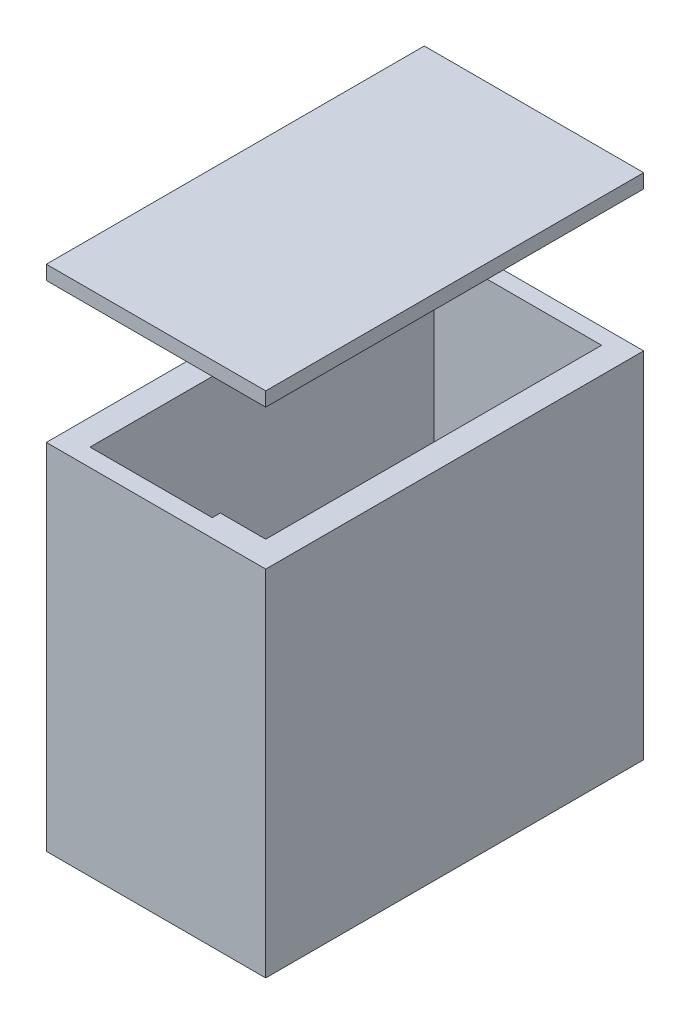
ISO-10303-21;
HEADER;
FILE_DESCRIPTION(('STEP AP214'),'2;1');
FILE_NAME('part.step','',(''),(''),'','','');
FILE_SCHEMA(('AUTOMOTIVE_DESIGN { 1 0 10303 214 1 1 1 1 }'));
ENDSEC;
DATA;
#1=APPLICATION_CONTEXT('core data for automotive mechanical design processes');
#2=APPLICATION_PROTOCOL_DEFINITION('international standard','automotive_design',2000,#1);
#3=PRODUCT_CONTEXT('',#1,'mechanical');
#4=PRODUCT('Part','Part','',(#3));
#5=PRODUCT_RELATED_PRODUCT_CATEGORY('part','',(#4));
#6=PRODUCT_DEFINITION_FORMATION('','',#4);
#7=PRODUCT_DEFINITION_CONTEXT('part definition',#1,'design');
#8=PRODUCT_DEFINITION('design','',#6,#7);
#9=PRODUCT_DEFINITION_SHAPE('','',#8);
#10=(LENGTH_UNIT() NAMED_UNIT(*) SI_UNIT(.MILLI.,.METRE.));
#11=(NAMED_UNIT(*) PLANE_ANGLE_UNIT() SI_UNIT($,.RADIAN.));
#12=(NAMED_UNIT(*) SI_UNIT($,.STERADIAN.) SOLID_ANGLE_UNIT());
#13=UNCERTAINTY_MEASURE_WITH_UNIT(LENGTH_MEASURE(1.E-05),#10,'distance_accuracy_value','');
#14=(GEOMETRIC_REPRESENTATION_CONTEXT(3) GLOBAL_UNCERTAINTY_ASSIGNED_CONTEXT((#13)) GLOBAL_UNIT_ASSIGNED_CONTEXT((#10,
#11,#12)) REPRESENTATION_CONTEXT('',''));
#15=CARTESIAN_POINT('',(0.,0.,0.));
#16=DIRECTION('',(0.,0.,1.));
#17=DIRECTION('',(1.,0.,0.));
#18=AXIS2_PLACEMENT_3D('',#15,#16,#17);
#19=CARTESIAN_POINT('',(0.,2090.,0.));
#20=DIRECTION('',(1.,0.,0.));
#21=DIRECTION('',(0.,0.,-1.));
#22=AXIS2_PLACEMENT_3D('',#19,#20,#21);
#23=PLANE('',#22);
#24=DIRECTION('',(0.,0.,1.));
#25=VECTOR('',#24,1.);
#26=CARTESIAN_POINT('',(0.,2090.,0.));
#27=LINE('',#26,#25);
#28=CARTESIAN_POINT('',(0.,2090.,-2337.20858757062));
#29=VERTEX_POINT('',#28);
#30=CARTESIAN_POINT('',(0.,2090.,0.));
#31=VERTEX_POINT('',#30);
#32=EDGE_CURVE('E217',#29,#31,#27,.T.);
#33=ORIENTED_EDGE('',*,*,#32,.F.);
#34=DIRECTION('',(0.,1.,0.));
#35=VECTOR('',#34,1.);
#36=CARTESIAN_POINT('',(0.,-100.,-2337.20858757062));
#37=LINE('',#36,#35);
#38=CARTESIAN_POINT('',(0.,-100.,-2337.20858757062));
#39=VERTEX_POINT('',#38);
#40=EDGE_CURVE('E232',#39,#29,#37,.T.);
#41=ORIENTED_EDGE('',*,*,#40,.F.);
#42=DIRECTION('',(0.,0.,-1.));
#43=VECTOR('',#42,1.);
#44=CARTESIAN_POINT('',(0.,-100.,0.));
#45=LINE('',#44,#43);
#46=CARTESIAN_POINT('',(0.,-100.,0.));
#47=VERTEX_POINT('',#46);
#48=EDGE_CURVE('E222',#47,#39,#45,.T.);
#49=ORIENTED_EDGE('',*,*,#48,.F.);
#50=DIRECTION('',(0.,-1.,0.));
#51=VECTOR('',#50,1.);
#52=CARTESIAN_POINT('',(0.,2090.,0.));
#53=LINE('',#52,#51);
#54=EDGE_CURVE('E253',#31,#47,#53,.T.);
#55=ORIENTED_EDGE('',*,*,#54,.F.);
#56=EDGE_LOOP('',(#33,#41,#49,#55));
#57=FACE_BOUND('',#56,.T.);
#58=ADVANCED_FACE('F99',(#57),#23,.F.);
#59=CARTESIAN_POINT('',(0.,2090.,0.));
#60=DIRECTION('',(0.,0.,-1.));
#61=DIRECTION('',(-1.,0.,0.));
#62=AXIS2_PLACEMENT_3D('',#59,#60,#61);
#63=PLANE('',#62);
#64=ORIENTED_EDGE('',*,*,#54,.T.);
#65=DIRECTION('',(-1.,0.,0.));
#66=VECTOR('',#65,1.);
#67=CARTESIAN_POINT('',(1356.72768361582,-100.,0.));
#68=LINE('',#67,#66);
#69=CARTESIAN_POINT('',(1356.72768361582,-100.,0.));
#70=VERTEX_POINT('',#69);
#71=EDGE_CURVE('E224',#70,#47,#68,.T.);
#72=ORIENTED_EDGE('',*,*,#71,.F.);
#73=DIRECTION('',(0.,-1.,0.));
#74=VECTOR('',#73,1.);
#75=CARTESIAN_POINT('',(1356.72768361582,2090.,0.));
#76=LINE('',#75,#74);
#77=CARTESIAN_POINT('',(1356.72768361582,2090.,0.));
#78=VERTEX_POINT('',#77);
#79=EDGE_CURVE('E220',#78,#70,#76,.T.);
#80=ORIENTED_EDGE('',*,*,#79,.F.);
#81=DIRECTION('',(1.,0.,0.));
#82=VECTOR('',#81,1.);
#83=CARTESIAN_POINT('',(0.,2090.,0.));
#84=LINE('',#83,#82);
#85=EDGE_CURVE('E214',#31,#78,#84,.T.);
#86=ORIENTED_EDGE('',*,*,#85,.F.);
#87=EDGE_LOOP('',(#64,#72,#80,#86));
#88=FACE_BOUND('',#87,.T.);
#89=ADVANCED_FACE('F258',(#88),#63,.F.);
#90=CARTESIAN_POINT('',(1356.72768361582,2090.,0.));
#91=DIRECTION('',(-1.,0.,0.));
#92=DIRECTION('',(0.,0.,1.));
#93=AXIS2_PLACEMENT_3D('',#90,#91,#92);
#94=PLANE('',#93);
#95=ORIENTED_EDGE('',*,*,#79,.T.);
#96=DIRECTION('',(0.,0.,1.));
#97=VECTOR('',#96,1.);
#98=CARTESIAN_POINT('',(1356.72768361582,-100.,0.));
#99=LINE('',#98,#97);
#100=CARTESIAN_POINT('',(1356.72768361582,-100.,-2337.20858757062));
#101=VERTEX_POINT('',#100);
#102=EDGE_CURVE('E213',#101,#70,#99,.T.);
#103=ORIENTED_EDGE('',*,*,#102,.F.);
#104=DIRECTION('',(0.,-1.,0.));
#105=VECTOR('',#104,1.);
#106=CARTESIAN_POINT('',(1356.72768361582,-100.,-2337.20858757062));
#107=LINE('',#106,#105);
#108=CARTESIAN_POINT('',(1356.72768361582,2090.,-2337.20858757062));
#109=VERTEX_POINT('',#108);
#110=EDGE_CURVE('E103',#109,#101,#107,.T.);
#111=ORIENTED_EDGE('',*,*,#110,.F.);
#112=DIRECTION('',(0.,0.,-1.));
#113=VECTOR('',#112,1.);
#114=CARTESIAN_POINT('',(1356.72768361582,2090.,0.));
#115=LINE('',#114,#113);
#116=EDGE_CURVE('E211',#78,#109,#115,.T.);
#117=ORIENTED_EDGE('',*,*,#116,.F.);
#118=EDGE_LOOP('',(#95,#103,#111,#117));
#119=FACE_BOUND('',#118,.T.);
#120=ADVANCED_FACE('F245',(#119),#94,.F.);
#121=CARTESIAN_POINT('',(0.,2090.,0.));
#122=DIRECTION('',(0.,-1.,0.));
#123=DIRECTION('',(0.,0.,-1.));
#124=AXIS2_PLACEMENT_3D('',#121,#122,#123);
#125=PLANE('',#124);
#126=ORIENTED_EDGE('',*,*,#32,.T.);
#127=ORIENTED_EDGE('',*,*,#85,.T.);
#128=ORIENTED_EDGE('',*,*,#116,.T.);
#129=DIRECTION('',(1.,0.,0.));
#130=VECTOR('',#129,1.);
#131=CARTESIAN_POINT('',(1356.72768361582,2090.,-2337.20858757062));
#132=LINE('',#131,#130);
#133=EDGE_CURVE('E171',#29,#109,#132,.T.);
#134=ORIENTED_EDGE('',*,*,#133,.F.);
#135=EDGE_LOOP('',(#126,#127,#128,#134));
#136=FACE_BOUND('',#135,.T.);
#137=DIRECTION('',(0.,0.,1.));
#138=VECTOR('',#137,1.);
#139=CARTESIAN_POINT('',(1196.72768361582,2090.,-160.));
#140=LINE('',#139,#138);
#141=CARTESIAN_POINT('',(1196.72768361582,2090.,-2237.20858757062));
#142=VERTEX_POINT('',#141);
#143=CARTESIAN_POINT('',(1196.72768361582,2090.,-160.));
#144=VERTEX_POINT('',#143);
#145=EDGE_CURVE('E204',#142,#144,#140,.T.);
#146=ORIENTED_EDGE('',*,*,#145,.T.);
#147=DIRECTION('',(-1.,0.,0.));
#148=VECTOR('',#147,1.);
#149=CARTESIAN_POINT('',(915.947269303202,2090.,-160.));
#150=LINE('',#149,#148);
#151=CARTESIAN_POINT('',(915.947269303202,2090.,-160.));
#152=VERTEX_POINT('',#151);
#153=EDGE_CURVE('E208',#144,#152,#150,.T.);
#154=ORIENTED_EDGE('',*,*,#153,.T.);
#155=DIRECTION('',(0.,0.,1.));
#156=VECTOR('',#155,1.);
#157=CARTESIAN_POINT('',(915.947269303202,2090.,-110.));
#158=LINE('',#157,#156);
#159=CARTESIAN_POINT('',(915.947269303202,2090.,-110.));
#160=VERTEX_POINT('',#159);
#161=EDGE_CURVE('E166',#152,#160,#158,.T.);
#162=ORIENTED_EDGE('',*,*,#161,.T.);
#163=DIRECTION('',(-1.,0.,0.));
#164=VECTOR('',#163,1.);
#165=CARTESIAN_POINT('',(160.,2090.,-110.));
#166=LINE('',#165,#164);
#167=CARTESIAN_POINT('',(160.,2090.,-110.));
#168=VERTEX_POINT('',#167);
#169=EDGE_CURVE('E159',#160,#168,#166,.T.);
#170=ORIENTED_EDGE('',*,*,#169,.T.);
#171=DIRECTION('',(0.,0.,-1.));
#172=VECTOR('',#171,1.);
#173=CARTESIAN_POINT('',(160.,2090.,-2237.20858757062));
#174=LINE('',#173,#172);
#175=CARTESIAN_POINT('',(160.000000000001,2090.,-2237.20858757062));
#176=VERTEX_POINT('',#175);
#177=EDGE_CURVE('E162',#168,#176,#174,.T.);
#178=ORIENTED_EDGE('',*,*,#177,.T.);
#179=DIRECTION('',(1.,0.,0.));
#180=VECTOR('',#179,1.);
#181=CARTESIAN_POINT('',(1356.72768361582,2090.,-2237.20858757062));
#182=LINE('',#181,#180);
#183=EDGE_CURVE('E181',#176,#142,#182,.T.);
#184=ORIENTED_EDGE('',*,*,#183,.T.);
#185=EDGE_LOOP('',(#146,#154,#162,#170,#178,#184));
#186=FACE_BOUND('',#185,.T.);
#187=ADVANCED_FACE('F101',(#136,#186),#125,.F.);
#188=CARTESIAN_POINT('',(0.,-100.,0.));
#189=DIRECTION('',(0.,1.,0.));
#190=DIRECTION('',(0.,0.,1.));
#191=AXIS2_PLACEMENT_3D('',#188,#189,#190);
#192=PLANE('',#191);
#193=ORIENTED_EDGE('',*,*,#102,.T.);
#194=ORIENTED_EDGE('',*,*,#71,.T.);
#195=ORIENTED_EDGE('',*,*,#48,.T.);
#196=DIRECTION('',(-1.,0.,0.));
#197=VECTOR('',#196,1.);
#198=CARTESIAN_POINT('',(1356.72768361582,-100.,-2337.20858757062));
#199=LINE('',#198,#197);
#200=EDGE_CURVE('E234',#101,#39,#199,.T.);
#201=ORIENTED_EDGE('',*,*,#200,.F.);
#202=EDGE_LOOP('',(#193,#194,#195,#201));
#203=FACE_BOUND('',#202,.T.);
#204=ADVANCED_FACE('F249',(#203),#192,.F.);
#205=CARTESIAN_POINT('',(0.,0.,-2337.20858757062));
#206=DIRECTION('',(0.,0.,1.));
#207=DIRECTION('',(1.,0.,0.));
#208=AXIS2_PLACEMENT_3D('',#205,#206,#207);
#209=PLANE('',#208);
#210=ORIENTED_EDGE('',*,*,#110,.T.);
#211=ORIENTED_EDGE('',*,*,#200,.T.);
#212=ORIENTED_EDGE('',*,*,#40,.T.);
#213=ORIENTED_EDGE('',*,*,#133,.T.);
#214=EDGE_LOOP('',(#210,#211,#212,#213));
#215=FACE_BOUND('',#214,.T.);
#216=ADVANCED_FACE('F241',(#215),#209,.F.);
#217=CARTESIAN_POINT('',(915.947269303202,2090.,-160.));
#218=DIRECTION('',(0.,0.,1.));
#219=DIRECTION('',(1.,0.,0.));
#220=AXIS2_PLACEMENT_3D('',#217,#218,#219);
#221=PLANE('',#220);
#222=DIRECTION('',(-1.,0.,0.));
#223=VECTOR('',#222,1.);
#224=CARTESIAN_POINT('',(915.947269303202,0.,-160.));
#225=LINE('',#224,#223);
#226=CARTESIAN_POINT('',(1196.72768361582,0.,-160.));
#227=VERTEX_POINT('',#226);
#228=CARTESIAN_POINT('',(915.947269303202,0.,-160.));
#229=VERTEX_POINT('',#228);
#230=EDGE_CURVE('E200',#227,#229,#225,.T.);
#231=ORIENTED_EDGE('',*,*,#230,.T.);
#232=DIRECTION('',(0.,-1.,0.));
#233=VECTOR('',#232,1.);
#234=CARTESIAN_POINT('',(915.947269303202,2090.,-160.));
#235=LINE('',#234,#233);
#236=EDGE_CURVE('E195',#152,#229,#235,.T.);
#237=ORIENTED_EDGE('',*,*,#236,.F.);
#238=ORIENTED_EDGE('',*,*,#153,.F.);
#239=DIRECTION('',(0.,-1.,0.));
#240=VECTOR('',#239,1.);
#241=CARTESIAN_POINT('',(1196.72768361582,2090.,-160.));
#242=LINE('',#241,#240);
#243=EDGE_CURVE('E203',#144,#227,#242,.T.);
#244=ORIENTED_EDGE('',*,*,#243,.T.);
#245=EDGE_LOOP('',(#231,#237,#238,#244));
#246=FACE_BOUND('',#245,.T.);
#247=ADVANCED_FACE('F271',(#246),#221,.F.);
#248=CARTESIAN_POINT('',(915.947269303202,2090.,-110.));
#249=DIRECTION('',(1.,0.,0.));
#250=DIRECTION('',(0.,0.,-1.));
#251=AXIS2_PLACEMENT_3D('',#248,#249,#250);
#252=PLANE('',#251);
#253=DIRECTION('',(0.,0.,1.));
#254=VECTOR('',#253,1.);
#255=CARTESIAN_POINT('',(915.947269303202,0.,-110.));
#256=LINE('',#255,#254);
#257=CARTESIAN_POINT('',(915.947269303202,0.,-110.));
#258=VERTEX_POINT('',#257);
#259=EDGE_CURVE('E197',#229,#258,#256,.T.);
#260=ORIENTED_EDGE('',*,*,#259,.T.);
#261=DIRECTION('',(0.,-1.,0.));
#262=VECTOR('',#261,1.);
#263=CARTESIAN_POINT('',(915.947269303202,2090.,-110.));
#264=LINE('',#263,#262);
#265=EDGE_CURVE('E189',#160,#258,#264,.T.);
#266=ORIENTED_EDGE('',*,*,#265,.F.);
#267=ORIENTED_EDGE('',*,*,#161,.F.);
#268=ORIENTED_EDGE('',*,*,#236,.T.);
#269=EDGE_LOOP('',(#260,#266,#267,#268));
#270=FACE_BOUND('',#269,.T.);
#271=ADVANCED_FACE('F266',(#270),#252,.F.);
#272=CARTESIAN_POINT('',(0.,0.,0.));
#273=DIRECTION('',(0.,1.,0.));
#274=DIRECTION('',(0.,0.,1.));
#275=AXIS2_PLACEMENT_3D('',#272,#273,#274);
#276=PLANE('',#275);
#277=DIRECTION('',(0.,0.,-1.));
#278=VECTOR('',#277,1.);
#279=CARTESIAN_POINT('',(160.,0.,-2237.20858757062));
#280=LINE('',#279,#278);
#281=CARTESIAN_POINT('',(160.,0.,-110.));
#282=VERTEX_POINT('',#281);
#283=CARTESIAN_POINT('',(160.000000000001,0.,-2237.20858757062));
#284=VERTEX_POINT('',#283);
#285=EDGE_CURVE('E187',#282,#284,#280,.T.);
#286=ORIENTED_EDGE('',*,*,#285,.F.);
#287=DIRECTION('',(-1.,0.,0.));
#288=VECTOR('',#287,1.);
#289=CARTESIAN_POINT('',(160.,0.,-110.));
#290=LINE('',#289,#288);
#291=EDGE_CURVE('E186',#258,#282,#290,.T.);
#292=ORIENTED_EDGE('',*,*,#291,.F.);
#293=ORIENTED_EDGE('',*,*,#259,.F.);
#294=ORIENTED_EDGE('',*,*,#230,.F.);
#295=DIRECTION('',(0.,0.,1.));
#296=VECTOR('',#295,1.);
#297=CARTESIAN_POINT('',(1196.72768361582,0.,-160.));
#298=LINE('',#297,#296);
#299=CARTESIAN_POINT('',(1196.72768361582,0.,-2237.20858757062));
#300=VERTEX_POINT('',#299);
#301=EDGE_CURVE('E109',#300,#227,#298,.T.);
#302=ORIENTED_EDGE('',*,*,#301,.F.);
#303=DIRECTION('',(1.,0.,0.));
#304=VECTOR('',#303,1.);
#305=CARTESIAN_POINT('',(1356.72768361582,0.,-2237.20858757062));
#306=LINE('',#305,#304);
#307=EDGE_CURVE('E118',#284,#300,#306,.T.);
#308=ORIENTED_EDGE('',*,*,#307,.F.);
#309=EDGE_LOOP('',(#286,#292,#293,#294,#302,#308));
#310=FACE_BOUND('',#309,.T.);
#311=ADVANCED_FACE('F279',(#310),#276,.T.);
#312=CARTESIAN_POINT('',(0.,0.,-2237.20858757062));
#313=DIRECTION('',(0.,0.,1.));
#314=DIRECTION('',(1.,0.,0.));
#315=AXIS2_PLACEMENT_3D('',#312,#313,#314);
#316=PLANE('',#315);
#317=ORIENTED_EDGE('',*,*,#183,.F.);
#318=DIRECTION('',(0.,-1.,0.));
#319=VECTOR('',#318,1.);
#320=CARTESIAN_POINT('',(160.,2090.,-2237.20858757062));
#321=LINE('',#320,#319);
#322=EDGE_CURVE('E180',#176,#284,#321,.T.);
#323=ORIENTED_EDGE('',*,*,#322,.T.);
#324=ORIENTED_EDGE('',*,*,#307,.T.);
#325=DIRECTION('',(0.,-1.,0.));
#326=VECTOR('',#325,1.);
#327=CARTESIAN_POINT('',(1196.72768361582,2090.,-2237.20858757062));
#328=LINE('',#327,#326);
#329=EDGE_CURVE('E13',#142,#300,#328,.T.);
#330=ORIENTED_EDGE('',*,*,#329,.F.);
#331=EDGE_LOOP('',(#317,#323,#324,#330));
#332=FACE_BOUND('',#331,.T.);
#333=ADVANCED_FACE('F284',(#332),#316,.T.);
#334=CARTESIAN_POINT('',(160.,2090.,-2237.20858757062));
#335=DIRECTION('',(-1.,0.,0.));
#336=DIRECTION('',(0.,0.,1.));
#337=AXIS2_PLACEMENT_3D('',#334,#335,#336);
#338=PLANE('',#337);
#339=ORIENTED_EDGE('',*,*,#285,.T.);
#340=ORIENTED_EDGE('',*,*,#322,.F.);
#341=ORIENTED_EDGE('',*,*,#177,.F.);
#342=DIRECTION('',(0.,-1.,0.));
#343=VECTOR('',#342,1.);
#344=CARTESIAN_POINT('',(160.,2090.,-110.));
#345=LINE('',#344,#343);
#346=EDGE_CURVE('E179',#168,#282,#345,.T.);
#347=ORIENTED_EDGE('',*,*,#346,.T.);
#348=EDGE_LOOP('',(#339,#340,#341,#347));
#349=FACE_BOUND('',#348,.T.);
#350=ADVANCED_FACE('F177',(#349),#338,.F.);
#351=CARTESIAN_POINT('',(160.,2090.,-110.));
#352=DIRECTION('',(0.,0.,1.));
#353=DIRECTION('',(1.,0.,0.));
#354=AXIS2_PLACEMENT_3D('',#351,#352,#353);
#355=PLANE('',#354);
#356=ORIENTED_EDGE('',*,*,#291,.T.);
#357=ORIENTED_EDGE('',*,*,#346,.F.);
#358=ORIENTED_EDGE('',*,*,#169,.F.);
#359=ORIENTED_EDGE('',*,*,#265,.T.);
#360=EDGE_LOOP('',(#356,#357,#358,#359));
#361=FACE_BOUND('',#360,.T.);
#362=ADVANCED_FACE('F184',(#361),#355,.F.);
#363=CARTESIAN_POINT('',(1196.72768361582,2090.,-160.));
#364=DIRECTION('',(1.,0.,0.));
#365=DIRECTION('',(0.,0.,-1.));
#366=AXIS2_PLACEMENT_3D('',#363,#364,#365);
#367=PLANE('',#366);
#368=ORIENTED_EDGE('',*,*,#301,.T.);
#369=ORIENTED_EDGE('',*,*,#243,.F.);
#370=ORIENTED_EDGE('',*,*,#145,.F.);
#371=ORIENTED_EDGE('',*,*,#329,.T.);
#372=EDGE_LOOP('',(#368,#369,#370,#371));
#373=FACE_BOUND('',#372,.T.);
#374=ADVANCED_FACE('F283',(#373),#367,.F.);
#375=CLOSED_SHELL('',(#58,#89,#120,#187,#204,#216,#247,#271,#311,#333,#350,#362,#374));
#376=MANIFOLD_SOLID_BREP('B2',#375);
#377=CARTESIAN_POINT('',(-1498.92429805271,2957.09963159308,-6636.09763041057));
#378=DIRECTION('',(0.,-1.,0.));
#379=DIRECTION('',(0.,0.,-1.));
#380=AXIS2_PLACEMENT_3D('',#377,#378,#379);
#381=PLANE('',#380);
#382=DIRECTION('',(0.,0.,1.));
#383=VECTOR('',#382,1.);
#384=CARTESIAN_POINT('',(0.,2957.09963159308,0.));
#385=LINE('',#384,#383);
#386=CARTESIAN_POINT('',(0.,2957.09963159308,-2337.20858757062));
#387=VERTEX_POINT('',#386);
#388=CARTESIAN_POINT('',(0.,2957.09963159308,0.));
#389=VERTEX_POINT('',#388);
#390=EDGE_CURVE('E521',#387,#389,#385,.T.);
#391=ORIENTED_EDGE('',*,*,#390,.F.);
#392=DIRECTION('',(-1.,0.,0.));
#393=VECTOR('',#392,1.);
#394=CARTESIAN_POINT('',(-1498.92429805271,2957.09963159308,-2337.20858757062));
#395=LINE('',#394,#393);
#396=CARTESIAN_POINT('',(1356.72768361582,2957.09963159308,-2337.20858757062));
#397=VERTEX_POINT('',#396);
#398=EDGE_CURVE('E97',#397,#387,#395,.T.);
#399=ORIENTED_EDGE('',*,*,#398,.F.);
#400=DIRECTION('',(0.,0.,-1.));
#401=VECTOR('',#400,1.);
#402=CARTESIAN_POINT('',(1356.72768361582,2957.09963159308,0.));
#403=LINE('',#402,#401);
#404=CARTESIAN_POINT('',(1356.72768361582,2957.09963159308,0.));
#405=VERTEX_POINT('',#404);
#406=EDGE_CURVE('E444',#405,#397,#403,.T.);
#407=ORIENTED_EDGE('',*,*,#406,.F.);
#408=DIRECTION('',(1.,0.,0.));
#409=VECTOR('',#408,1.);
#410=CARTESIAN_POINT('',(-1498.92429805271,2957.09963159308,0.));
#411=LINE('',#410,#409);
#412=EDGE_CURVE('E527',#389,#405,#411,.T.);
#413=ORIENTED_EDGE('',*,*,#412,.F.);
#414=EDGE_LOOP('',(#391,#399,#407,#413));
#415=FACE_BOUND('',#414,.T.);
#416=DIRECTION('',(-1.,0.,0.));
#417=VECTOR('',#416,1.);
#418=CARTESIAN_POINT('',(666.86384180791,2957.09963159308,-1157.10429378531));
#419=LINE('',#418,#417);
#420=CARTESIAN_POINT('',(689.86384180791,2957.09963159308,-1157.10429378531));
#421=VERTEX_POINT('',#420);
#422=CARTESIAN_POINT('',(666.86384180791,2957.09963159308,-1157.10429378531));
#423=VERTEX_POINT('',#422);
#424=EDGE_CURVE('E558',#421,#423,#419,.T.);
#425=ORIENTED_EDGE('',*,*,#424,.F.);
#426=DIRECTION('',(0.,0.,1.));
#427=VECTOR('',#426,1.);
#428=CARTESIAN_POINT('',(689.86384180791,2957.09963159308,-1157.10429378531));
#429=LINE('',#428,#427);
#430=CARTESIAN_POINT('',(689.86384180791,2957.09963159308,-1180.10429378531));
#431=VERTEX_POINT('',#430);
#432=EDGE_CURVE('E509',#431,#421,#429,.T.);
#433=ORIENTED_EDGE('',*,*,#432,.F.);
#434=DIRECTION('',(1.,0.,0.));
#435=VECTOR('',#434,1.);
#436=CARTESIAN_POINT('',(666.86384180791,2957.09963159308,-1180.10429378531));
#437=LINE('',#436,#435);
#438=CARTESIAN_POINT('',(666.86384180791,2957.09963159308,-1180.10429378531));
#439=VERTEX_POINT('',#438);
#440=EDGE_CURVE('E505',#439,#431,#437,.T.);
#441=ORIENTED_EDGE('',*,*,#440,.F.);
#442=DIRECTION('',(0.,0.,-1.));
#443=VECTOR('',#442,1.);
#444=CARTESIAN_POINT('',(666.86384180791,2957.09963159308,-1157.10429378531));
#445=LINE('',#444,#443);
#446=EDGE_CURVE('E560',#423,#439,#445,.T.);
#447=ORIENTED_EDGE('',*,*,#446,.F.);
#448=EDGE_LOOP('',(#425,#433,#441,#447));
#449=FACE_BOUND('',#448,.T.);
#450=ADVANCED_FACE('F422',(#415,#449),#381,.T.);
#451=CARTESIAN_POINT('',(-1498.92429805271,3044.43203528892,-6636.09763041057));
#452=DIRECTION('',(0.,1.,0.));
#453=DIRECTION('',(0.,0.,1.));
#454=AXIS2_PLACEMENT_3D('',#451,#452,#453);
#455=PLANE('',#454);
#456=DIRECTION('',(0.,0.,1.));
#457=VECTOR('',#456,1.);
#458=CARTESIAN_POINT('',(0.,3044.43203528892,0.));
#459=LINE('',#458,#457);
#460=CARTESIAN_POINT('',(0.,3044.43203528892,-2337.20858757062));
#461=VERTEX_POINT('',#460);
#462=CARTESIAN_POINT('',(0.,3044.43203528892,0.));
#463=VERTEX_POINT('',#462);
#464=EDGE_CURVE('E517',#461,#463,#459,.T.);
#465=ORIENTED_EDGE('',*,*,#464,.T.);
#466=DIRECTION('',(-1.,0.,0.));
#467=VECTOR('',#466,1.);
#468=CARTESIAN_POINT('',(-1498.92429805271,3044.43203528892,0.));
#469=LINE('',#468,#467);
#470=CARTESIAN_POINT('',(1356.72768361582,3044.43203528892,0.));
#471=VERTEX_POINT('',#470);
#472=EDGE_CURVE('E536',#471,#463,#469,.T.);
#473=ORIENTED_EDGE('',*,*,#472,.F.);
#474=DIRECTION('',(0.,0.,-1.));
#475=VECTOR('',#474,1.);
#476=CARTESIAN_POINT('',(1356.72768361582,3044.43203528892,0.));
#477=LINE('',#476,#475);
#478=CARTESIAN_POINT('',(1356.72768361582,3044.43203528892,-2337.20858757062));
#479=VERTEX_POINT('',#478);
#480=EDGE_CURVE('E512',#471,#479,#477,.T.);
#481=ORIENTED_EDGE('',*,*,#480,.T.);
#482=DIRECTION('',(1.,0.,0.));
#483=VECTOR('',#482,1.);
#484=CARTESIAN_POINT('',(-1498.92429805271,3044.43203528892,-2337.20858757062));
#485=LINE('',#484,#483);
#486=EDGE_CURVE('E429',#461,#479,#485,.T.);
#487=ORIENTED_EDGE('',*,*,#486,.F.);
#488=EDGE_LOOP('',(#465,#473,#481,#487));
#489=FACE_BOUND('',#488,.T.);
#490=ADVANCED_FACE('F545',(#489),#455,.T.);
#491=CARTESIAN_POINT('',(0.,0.,0.));
#492=DIRECTION('',(0.,0.,-1.));
#493=DIRECTION('',(-1.,0.,0.));
#494=AXIS2_PLACEMENT_3D('',#491,#492,#493);
#495=PLANE('',#494);
#496=ORIENTED_EDGE('',*,*,#472,.T.);
#497=DIRECTION('',(0.,-1.,0.));
#498=VECTOR('',#497,1.);
#499=CARTESIAN_POINT('',(0.,3044.43203528892,0.));
#500=LINE('',#499,#498);
#501=EDGE_CURVE('E524',#463,#389,#500,.T.);
#502=ORIENTED_EDGE('',*,*,#501,.T.);
#503=ORIENTED_EDGE('',*,*,#412,.T.);
#504=DIRECTION('',(0.,-1.,0.));
#505=VECTOR('',#504,1.);
#506=CARTESIAN_POINT('',(1356.72768361582,3044.43203528892,0.));
#507=LINE('',#506,#505);
#508=EDGE_CURVE('E523',#471,#405,#507,.T.);
#509=ORIENTED_EDGE('',*,*,#508,.F.);
#510=EDGE_LOOP('',(#496,#502,#503,#509));
#511=FACE_BOUND('',#510,.T.);
#512=ADVANCED_FACE('F542',(#511),#495,.F.);
#513=CARTESIAN_POINT('',(0.,0.,-2337.20858757062));
#514=DIRECTION('',(0.,0.,1.));
#515=DIRECTION('',(1.,0.,0.));
#516=AXIS2_PLACEMENT_3D('',#513,#514,#515);
#517=PLANE('',#516);
#518=ORIENTED_EDGE('',*,*,#398,.T.);
#519=DIRECTION('',(0.,-1.,0.));
#520=VECTOR('',#519,1.);
#521=CARTESIAN_POINT('',(0.,3044.43203528892,-2337.20858757062));
#522=LINE('',#521,#520);
#523=EDGE_CURVE('E520',#461,#387,#522,.T.);
#524=ORIENTED_EDGE('',*,*,#523,.F.);
#525=ORIENTED_EDGE('',*,*,#486,.T.);
#526=DIRECTION('',(0.,-1.,0.));
#527=VECTOR('',#526,1.);
#528=CARTESIAN_POINT('',(1356.72768361582,3044.43203528892,-2337.20858757062));
#529=LINE('',#528,#527);
#530=EDGE_CURVE('E530',#479,#397,#529,.T.);
#531=ORIENTED_EDGE('',*,*,#530,.T.);
#532=EDGE_LOOP('',(#518,#524,#525,#531));
#533=FACE_BOUND('',#532,.T.);
#534=ADVANCED_FACE('F552',(#533),#517,.F.);
#535=CARTESIAN_POINT('',(1356.72768361582,3044.43203528892,0.));
#536=DIRECTION('',(-1.,0.,0.));
#537=DIRECTION('',(0.,0.,1.));
#538=AXIS2_PLACEMENT_3D('',#535,#536,#537);
#539=PLANE('',#538);
#540=ORIENTED_EDGE('',*,*,#406,.T.);
#541=ORIENTED_EDGE('',*,*,#530,.F.);
#542=ORIENTED_EDGE('',*,*,#480,.F.);
#543=ORIENTED_EDGE('',*,*,#508,.T.);
#544=EDGE_LOOP('',(#540,#541,#542,#543));
#545=FACE_BOUND('',#544,.T.);
#546=ADVANCED_FACE('F587',(#545),#539,.F.);
#547=CARTESIAN_POINT('',(0.,3044.43203528892,0.));
#548=DIRECTION('',(1.,0.,0.));
#549=DIRECTION('',(0.,0.,-1.));
#550=AXIS2_PLACEMENT_3D('',#547,#548,#549);
#551=PLANE('',#550);
#552=ORIENTED_EDGE('',*,*,#390,.T.);
#553=ORIENTED_EDGE('',*,*,#501,.F.);
#554=ORIENTED_EDGE('',*,*,#464,.F.);
#555=ORIENTED_EDGE('',*,*,#523,.T.);
#556=EDGE_LOOP('',(#552,#553,#554,#555));
#557=FACE_BOUND('',#556,.T.);
#558=ADVANCED_FACE('F549',(#557),#551,.F.);
#559=CARTESIAN_POINT('',(689.86384180791,2947.09963159308,-1157.10429378531));
#560=DIRECTION('',(-1.,0.,0.));
#561=DIRECTION('',(0.,0.,1.));
#562=AXIS2_PLACEMENT_3D('',#559,#560,#561);
#563=PLANE('',#562);
#564=ORIENTED_EDGE('',*,*,#432,.T.);
#565=DIRECTION('',(0.,1.,0.));
#566=VECTOR('',#565,1.);
#567=CARTESIAN_POINT('',(689.86384180791,2947.09963159308,-1157.10429378531));
#568=LINE('',#567,#566);
#569=CARTESIAN_POINT('',(689.86384180791,2947.09963159308,-1157.10429378531));
#570=VERTEX_POINT('',#569);
#571=EDGE_CURVE('E490',#570,#421,#568,.T.);
#572=ORIENTED_EDGE('',*,*,#571,.F.);
#573=DIRECTION('',(0.,0.,1.));
#574=VECTOR('',#573,1.);
#575=CARTESIAN_POINT('',(689.86384180791,2947.09963159308,-1157.10429378531));
#576=LINE('',#575,#574);
#577=CARTESIAN_POINT('',(689.86384180791,2947.09963159308,-1180.10429378531));
#578=VERTEX_POINT('',#577);
#579=EDGE_CURVE('E497',#578,#570,#576,.T.);
#580=ORIENTED_EDGE('',*,*,#579,.F.);
#581=DIRECTION('',(0.,1.,0.));
#582=VECTOR('',#581,1.);
#583=CARTESIAN_POINT('',(689.86384180791,2947.09963159308,-1180.10429378531));
#584=LINE('',#583,#582);
#585=EDGE_CURVE('E567',#578,#431,#584,.T.);
#586=ORIENTED_EDGE('',*,*,#585,.T.);
#587=EDGE_LOOP('',(#564,#572,#580,#586));
#588=FACE_BOUND('',#587,.T.);
#589=ADVANCED_FACE('F507',(#588),#563,.F.);
#590=CARTESIAN_POINT('',(666.86384180791,2947.09963159308,-1157.10429378531));
#591=DIRECTION('',(0.,0.,-1.));
#592=DIRECTION('',(-1.,0.,0.));
#593=AXIS2_PLACEMENT_3D('',#590,#591,#592);
#594=PLANE('',#593);
#595=ORIENTED_EDGE('',*,*,#424,.T.);
#596=DIRECTION('',(0.,1.,0.));
#597=VECTOR('',#596,1.);
#598=CARTESIAN_POINT('',(666.86384180791,2947.09963159308,-1157.10429378531));
#599=LINE('',#598,#597);
#600=CARTESIAN_POINT('',(666.86384180791,2947.09963159308,-1157.10429378531));
#601=VERTEX_POINT('',#600);
#602=EDGE_CURVE('E493',#601,#423,#599,.T.);
#603=ORIENTED_EDGE('',*,*,#602,.F.);
#604=DIRECTION('',(-1.,0.,0.));
#605=VECTOR('',#604,1.);
#606=CARTESIAN_POINT('',(666.86384180791,2947.09963159308,-1157.10429378531));
#607=LINE('',#606,#605);
#608=EDGE_CURVE('E486',#570,#601,#607,.T.);
#609=ORIENTED_EDGE('',*,*,#608,.F.);
#610=ORIENTED_EDGE('',*,*,#571,.T.);
#611=EDGE_LOOP('',(#595,#603,#609,#610));
#612=FACE_BOUND('',#611,.T.);
#613=ADVANCED_FACE('F488',(#612),#594,.F.);
#614=CARTESIAN_POINT('',(666.86384180791,2947.09963159308,-1157.10429378531));
#615=DIRECTION('',(1.,0.,0.));
#616=DIRECTION('',(0.,0.,-1.));
#617=AXIS2_PLACEMENT_3D('',#614,#615,#616);
#618=PLANE('',#617);
#619=ORIENTED_EDGE('',*,*,#446,.T.);
#620=DIRECTION('',(0.,1.,0.));
#621=VECTOR('',#620,1.);
#622=CARTESIAN_POINT('',(666.86384180791,2947.09963159308,-1180.10429378531));
#623=LINE('',#622,#621);
#624=CARTESIAN_POINT('',(666.86384180791,2947.09963159308,-1180.10429378531));
#625=VERTEX_POINT('',#624);
#626=EDGE_CURVE('E436',#625,#439,#623,.T.);
#627=ORIENTED_EDGE('',*,*,#626,.F.);
#628=DIRECTION('',(0.,0.,-1.));
#629=VECTOR('',#628,1.);
#630=CARTESIAN_POINT('',(666.86384180791,2947.09963159308,-1157.10429378531));
#631=LINE('',#630,#629);
#632=EDGE_CURVE('E496',#601,#625,#631,.T.);
#633=ORIENTED_EDGE('',*,*,#632,.F.);
#634=ORIENTED_EDGE('',*,*,#602,.T.);
#635=EDGE_LOOP('',(#619,#627,#633,#634));
#636=FACE_BOUND('',#635,.T.);
#637=ADVANCED_FACE('F570',(#636),#618,.F.);
#638=CARTESIAN_POINT('',(666.86384180791,2947.09963159308,-1180.10429378531));
#639=DIRECTION('',(0.,0.,1.));
#640=DIRECTION('',(1.,0.,0.));
#641=AXIS2_PLACEMENT_3D('',#638,#639,#640);
#642=PLANE('',#641);
#643=ORIENTED_EDGE('',*,*,#440,.T.);
#644=ORIENTED_EDGE('',*,*,#585,.F.);
#645=DIRECTION('',(1.,0.,0.));
#646=VECTOR('',#645,1.);
#647=CARTESIAN_POINT('',(666.86384180791,2947.09963159308,-1180.10429378531));
#648=LINE('',#647,#646);
#649=EDGE_CURVE('E501',#625,#578,#648,.T.);
#650=ORIENTED_EDGE('',*,*,#649,.F.);
#651=ORIENTED_EDGE('',*,*,#626,.T.);
#652=EDGE_LOOP('',(#643,#644,#650,#651));
#653=FACE_BOUND('',#652,.T.);
#654=ADVANCED_FACE('F571',(#653),#642,.F.);
#655=CARTESIAN_POINT('',(0.,2947.09963159308,0.));
#656=DIRECTION('',(0.,-1.,0.));
#657=DIRECTION('',(0.,0.,-1.));
#658=AXIS2_PLACEMENT_3D('',#655,#656,#657);
#659=PLANE('',#658);
#660=ORIENTED_EDGE('',*,*,#579,.T.);
#661=ORIENTED_EDGE('',*,*,#608,.T.);
#662=ORIENTED_EDGE('',*,*,#632,.T.);
#663=ORIENTED_EDGE('',*,*,#649,.T.);
#664=EDGE_LOOP('',(#660,#661,#662,#663));
#665=FACE_BOUND('',#664,.T.);
#666=ADVANCED_FACE('F500',(#665),#659,.T.);
#667=CLOSED_SHELL('',(#450,#490,#512,#534,#546,#558,#589,#613,#637,#654,#666));
#668=MANIFOLD_SOLID_BREP('B7_NOT_SHOWN',#667);
#669=CARTESIAN_POINT('',(666.86384180791,2950.98343182898,-1183.25327707006));
#670=DIRECTION('',(0.,0.776760047179482,-0.629796656950265));
#671=DIRECTION('',(1.,0.,0.));
#672=AXIS2_PLACEMENT_3D('',#669,#670,#671);
#673=PLANE('',#672);
#674=DIRECTION('',(1.,0.,0.));
#675=VECTOR('',#674,1.);
#676=CARTESIAN_POINT('',(666.86384180791,2747.79823695881,-1433.85184696052));
#677=LINE('',#676,#675);
#678=CARTESIAN_POINT('',(543.193910722591,2747.79823695881,-1433.85184696052));
#679=VERTEX_POINT('',#678);
#680=CARTESIAN_POINT('',(813.533772893229,2747.79823695881,-1433.85184696052));
#681=VERTEX_POINT('',#680);
#682=EDGE_CURVE('E805',#679,#681,#677,.T.);
#683=ORIENTED_EDGE('',*,*,#682,.F.);
#684=DIRECTION('',(-0.349022157210281,-0.590191561693849,-0.727913081543159));
#685=VECTOR('',#684,1.);
#686=CARTESIAN_POINT('',(669.62289828922,2961.58787774189,-1170.17427797294));
#687=LINE('',#686,#685);
#688=CARTESIAN_POINT('',(661.054970088864,2947.09963159308,-1188.04336418974));
#689=VERTEX_POINT('',#688);
#690=EDGE_CURVE('E786',#689,#679,#687,.T.);
#691=ORIENTED_EDGE('',*,*,#690,.F.);
#692=DIRECTION('',(1.,0.,0.));
#693=VECTOR('',#692,1.);
#694=CARTESIAN_POINT('',(0.,2947.09963159308,-1188.04336418974));
#695=LINE('',#694,#693);
#696=CARTESIAN_POINT('',(695.672713526956,2947.09963159308,-1188.04336418974));
#697=VERTEX_POINT('',#696);
#698=EDGE_CURVE('E780',#689,#697,#695,.T.);
#699=ORIENTED_EDGE('',*,*,#698,.T.);
#700=DIRECTION('',(0.349022157210281,-0.590191561693849,-0.727913081543159));
#701=VECTOR('',#700,1.);
#702=CARTESIAN_POINT('',(690.146335865035,2956.44465853598,-1176.51767015984));
#703=LINE('',#702,#701);
#704=EDGE_CURVE('E777',#697,#681,#703,.T.);
#705=ORIENTED_EDGE('',*,*,#704,.T.);
#706=EDGE_LOOP('',(#683,#691,#699,#705));
#707=FACE_BOUND('',#706,.T.);
#708=ADVANCED_FACE('F683',(#707),#673,.T.);
#709=CARTESIAN_POINT('',(662.560080043293,2949.64475136893,-1157.10429378531));
#710=DIRECTION('',(-0.860752352923523,0.509023955169713,0.));
#711=DIRECTION('',(0.,0.,-1.));
#712=AXIS2_PLACEMENT_3D('',#709,#710,#711);
#713=PLANE('',#712);
#714=DIRECTION('',(0.,0.,-1.));
#715=VECTOR('',#714,1.);
#716=CARTESIAN_POINT('',(543.193910722591,2747.79823695881,-1157.10429378531));
#717=LINE('',#716,#715);
#718=CARTESIAN_POINT('',(543.193910722591,2747.79823695881,-905.727268600651));
#719=VERTEX_POINT('',#718);
#720=EDGE_CURVE('E697',#719,#679,#717,.T.);
#721=ORIENTED_EDGE('',*,*,#720,.F.);
#722=DIRECTION('',(-0.350776441324726,-0.593158031471685,0.724651252612039));
#723=VECTOR('',#722,1.);
#724=CARTESIAN_POINT('',(666.606272614016,2956.48680612934,-1160.67860539707));
#725=LINE('',#724,#723);
#726=CARTESIAN_POINT('',(661.054970088864,2947.09963159308,-1149.21045116959));
#727=VERTEX_POINT('',#726);
#728=EDGE_CURVE('E782',#727,#719,#725,.T.);
#729=ORIENTED_EDGE('',*,*,#728,.F.);
#730=DIRECTION('',(0.,0.,-1.));
#731=VECTOR('',#730,1.);
#732=CARTESIAN_POINT('',(661.054970088864,2947.09963159308,0.));
#733=LINE('',#732,#731);
#734=EDGE_CURVE('E785',#727,#689,#733,.T.);
#735=ORIENTED_EDGE('',*,*,#734,.T.);
#736=ORIENTED_EDGE('',*,*,#690,.T.);
#737=EDGE_LOOP('',(#721,#729,#735,#736));
#738=FACE_BOUND('',#737,.T.);
#739=ADVANCED_FACE('F802',(#738),#713,.T.);
#740=CARTESIAN_POINT('',(689.86384180791,2950.96873357804,-1153.93726839387));
#741=DIRECTION('',(0.,0.773820396991145,0.633405078287558));
#742=DIRECTION('',(-1.,0.,0.));
#743=AXIS2_PLACEMENT_3D('',#740,#741,#742);
#744=PLANE('',#743);
#745=DIRECTION('',(-1.,0.,0.));
#746=VECTOR('',#745,1.);
#747=CARTESIAN_POINT('',(689.86384180791,2747.79823695881,-905.727268600651));
#748=LINE('',#747,#746);
#749=CARTESIAN_POINT('',(813.533772893229,2747.79823695881,-905.727268600651));
#750=VERTEX_POINT('',#749);
#751=EDGE_CURVE('E804',#750,#719,#748,.T.);
#752=ORIENTED_EDGE('',*,*,#751,.F.);
#753=DIRECTION('',(0.350776441324726,-0.593158031471685,0.724651252612039));
#754=VECTOR('',#753,1.);
#755=CARTESIAN_POINT('',(687.105042058305,2961.58744361218,-1166.90996895442));
#756=LINE('',#755,#754);
#757=CARTESIAN_POINT('',(695.672713526956,2947.09963159308,-1149.21045116959));
#758=VERTEX_POINT('',#757);
#759=EDGE_CURVE('E773',#758,#750,#756,.T.);
#760=ORIENTED_EDGE('',*,*,#759,.F.);
#761=DIRECTION('',(-1.,0.,0.));
#762=VECTOR('',#761,1.);
#763=CARTESIAN_POINT('',(0.,2947.09963159308,-1149.21045116959));
#764=LINE('',#763,#762);
#765=EDGE_CURVE('E776',#758,#727,#764,.T.);
#766=ORIENTED_EDGE('',*,*,#765,.T.);
#767=ORIENTED_EDGE('',*,*,#728,.T.);
#768=EDGE_LOOP('',(#752,#760,#766,#767));
#769=FACE_BOUND('',#768,.T.);
#770=ADVANCED_FACE('F798',(#769),#744,.T.);
#771=CARTESIAN_POINT('',(694.167603572528,2949.64475136893,-1180.10429378531));
#772=DIRECTION('',(0.860752352923523,0.509023955169713,0.));
#773=DIRECTION('',(0.,0.,1.));
#774=AXIS2_PLACEMENT_3D('',#771,#772,#773);
#775=PLANE('',#774);
#776=DIRECTION('',(0.,0.,1.));
#777=VECTOR('',#776,1.);
#778=CARTESIAN_POINT('',(813.533772893229,2747.79823695881,-1180.10429378531));
#779=LINE('',#778,#777);
#780=EDGE_CURVE('E772',#681,#750,#779,.T.);
#781=ORIENTED_EDGE('',*,*,#780,.F.);
#782=ORIENTED_EDGE('',*,*,#704,.F.);
#783=DIRECTION('',(0.,0.,1.));
#784=VECTOR('',#783,1.);
#785=CARTESIAN_POINT('',(695.672713526957,2947.09963159308,0.));
#786=LINE('',#785,#784);
#787=EDGE_CURVE('E690',#697,#758,#786,.T.);
#788=ORIENTED_EDGE('',*,*,#787,.T.);
#789=ORIENTED_EDGE('',*,*,#759,.T.);
#790=EDGE_LOOP('',(#781,#782,#788,#789));
#791=FACE_BOUND('',#790,.T.);
#792=ADVANCED_FACE('F843',(#791),#775,.T.);
#793=CARTESIAN_POINT('',(0.,2947.09963159308,0.));
#794=DIRECTION('',(0.,-1.,0.));
#795=DIRECTION('',(0.,0.,-1.));
#796=AXIS2_PLACEMENT_3D('',#793,#794,#795);
#797=PLANE('',#796);
#798=DIRECTION('',(0.,0.,-1.));
#799=VECTOR('',#798,1.);
#800=CARTESIAN_POINT('',(666.86384180791,2947.09963159308,-1168.60429378531));
#801=LINE('',#800,#799);
#802=CARTESIAN_POINT('',(666.86384180791,2947.09963159308,-1157.10429378531));
#803=VERTEX_POINT('',#802);
#804=CARTESIAN_POINT('',(666.86384180791,2947.09963159308,-1180.10429378531));
#805=VERTEX_POINT('',#804);
#806=EDGE_CURVE('E764',#803,#805,#801,.T.);
#807=ORIENTED_EDGE('',*,*,#806,.T.);
#808=DIRECTION('',(1.,0.,0.));
#809=VECTOR('',#808,1.);
#810=CARTESIAN_POINT('',(678.36384180791,2947.09963159308,-1180.10429378531));
#811=LINE('',#810,#809);
#812=CARTESIAN_POINT('',(689.86384180791,2947.09963159308,-1180.10429378531));
#813=VERTEX_POINT('',#812);
#814=EDGE_CURVE('E763',#805,#813,#811,.T.);
#815=ORIENTED_EDGE('',*,*,#814,.T.);
#816=DIRECTION('',(0.,0.,1.));
#817=VECTOR('',#816,1.);
#818=CARTESIAN_POINT('',(689.86384180791,2947.09963159308,-1168.60429378531));
#819=LINE('',#818,#817);
#820=CARTESIAN_POINT('',(689.86384180791,2947.09963159308,-1157.10429378531));
#821=VERTEX_POINT('',#820);
#822=EDGE_CURVE('E781',#813,#821,#819,.T.);
#823=ORIENTED_EDGE('',*,*,#822,.T.);
#824=DIRECTION('',(-1.,0.,0.));
#825=VECTOR('',#824,1.);
#826=CARTESIAN_POINT('',(678.36384180791,2947.09963159308,-1157.10429378531));
#827=LINE('',#826,#825);
#828=EDGE_CURVE('E817',#821,#803,#827,.T.);
#829=ORIENTED_EDGE('',*,*,#828,.T.);
#830=EDGE_LOOP('',(#807,#815,#823,#829));
#831=FACE_BOUND('',#830,.T.);
#832=ORIENTED_EDGE('',*,*,#698,.F.);
#833=ORIENTED_EDGE('',*,*,#734,.F.);
#834=ORIENTED_EDGE('',*,*,#765,.F.);
#835=ORIENTED_EDGE('',*,*,#787,.F.);
#836=EDGE_LOOP('',(#832,#833,#834,#835));
#837=FACE_BOUND('',#836,.T.);
#838=ADVANCED_FACE('F821',(#831,#837),#797,.F.);
#839=CARTESIAN_POINT('',(666.86384180791,2947.09963159308,-1180.10429378531));
#840=DIRECTION('',(0.,0.776760047179482,-0.629796656950265));
#841=DIRECTION('',(1.,0.,0.));
#842=AXIS2_PLACEMENT_3D('',#839,#840,#841);
#843=PLANE('',#842);
#844=DIRECTION('',(-0.349022157210281,-0.590191561693849,-0.727913081543159));
#845=VECTOR('',#844,1.);
#846=CARTESIAN_POINT('',(413.431920903955,2518.54981579654,-1708.65644067797));
#847=LINE('',#846,#845);
#848=CARTESIAN_POINT('',(549.002782441638,2747.79823695881,-1425.91277655609));
#849=VERTEX_POINT('',#848);
#850=EDGE_CURVE('E755',#805,#849,#847,.T.);
#851=ORIENTED_EDGE('',*,*,#850,.T.);
#852=DIRECTION('',(1.,0.,0.));
#853=VECTOR('',#852,1.);
#854=CARTESIAN_POINT('',(666.86384180791,2747.79823695881,-1425.91277655609));
#855=LINE('',#854,#853);
#856=CARTESIAN_POINT('',(807.724901174183,2747.79823695881,-1425.91277655609));
#857=VERTEX_POINT('',#856);
#858=EDGE_CURVE('E420',#849,#857,#855,.T.);
#859=ORIENTED_EDGE('',*,*,#858,.T.);
#860=DIRECTION('',(0.349022157210281,-0.590191561693849,-0.727913081543159));
#861=VECTOR('',#860,1.);
#862=CARTESIAN_POINT('',(943.295762711865,2518.54981579654,-1708.65644067797));
#863=LINE('',#862,#861);
#864=EDGE_CURVE('E767',#813,#857,#863,.T.);
#865=ORIENTED_EDGE('',*,*,#864,.F.);
#866=ORIENTED_EDGE('',*,*,#814,.F.);
#867=EDGE_LOOP('',(#851,#859,#865,#866));
#868=FACE_BOUND('',#867,.T.);
#869=ADVANCED_FACE('F761',(#868),#843,.F.);
#870=CARTESIAN_POINT('',(666.86384180791,2947.09963159308,-1157.10429378531));
#871=DIRECTION('',(-0.860752352923523,0.509023955169713,0.));
#872=DIRECTION('',(0.,0.,-1.));
#873=AXIS2_PLACEMENT_3D('',#870,#871,#872);
#874=PLANE('',#873);
#875=DIRECTION('',(-0.350776441324726,-0.593158031471685,0.724651252612039));
#876=VECTOR('',#875,1.);
#877=CARTESIAN_POINT('',(413.431920903955,2518.54981579654,-633.552146892656));
#878=LINE('',#877,#876);
#879=CARTESIAN_POINT('',(549.002782441638,2747.79823695881,-913.621111216372));
#880=VERTEX_POINT('',#879);
#881=EDGE_CURVE('E758',#803,#880,#878,.T.);
#882=ORIENTED_EDGE('',*,*,#881,.T.);
#883=DIRECTION('',(0.,0.,-1.));
#884=VECTOR('',#883,1.);
#885=CARTESIAN_POINT('',(549.002782441638,2747.79823695881,-1157.10429378531));
#886=LINE('',#885,#884);
#887=EDGE_CURVE('E745',#880,#849,#886,.T.);
#888=ORIENTED_EDGE('',*,*,#887,.T.);
#889=ORIENTED_EDGE('',*,*,#850,.F.);
#890=ORIENTED_EDGE('',*,*,#806,.F.);
#891=EDGE_LOOP('',(#882,#888,#889,#890));
#892=FACE_BOUND('',#891,.T.);
#893=ADVANCED_FACE('F754',(#892),#874,.F.);
#894=CARTESIAN_POINT('',(689.86384180791,2947.09963159308,-1157.10429378531));
#895=DIRECTION('',(0.,0.773820396991145,0.633405078287558));
#896=DIRECTION('',(-1.,0.,0.));
#897=AXIS2_PLACEMENT_3D('',#894,#895,#896);
#898=PLANE('',#897);
#899=DIRECTION('',(0.350776441324726,-0.593158031471685,0.724651252612039));
#900=VECTOR('',#899,1.);
#901=CARTESIAN_POINT('',(943.295762711865,2518.54981579654,-633.552146892656));
#902=LINE('',#901,#900);
#903=CARTESIAN_POINT('',(807.724901174183,2747.79823695881,-913.621111216372));
#904=VERTEX_POINT('',#903);
#905=EDGE_CURVE('E814',#821,#904,#902,.T.);
#906=ORIENTED_EDGE('',*,*,#905,.T.);
#907=DIRECTION('',(-1.,0.,0.));
#908=VECTOR('',#907,1.);
#909=CARTESIAN_POINT('',(689.86384180791,2747.79823695881,-913.621111216372));
#910=LINE('',#909,#908);
#911=EDGE_CURVE('E759',#904,#880,#910,.T.);
#912=ORIENTED_EDGE('',*,*,#911,.T.);
#913=ORIENTED_EDGE('',*,*,#881,.F.);
#914=ORIENTED_EDGE('',*,*,#828,.F.);
#915=EDGE_LOOP('',(#906,#912,#913,#914));
#916=FACE_BOUND('',#915,.T.);
#917=ADVANCED_FACE('F823',(#916),#898,.F.);
#918=CARTESIAN_POINT('',(689.86384180791,2947.09963159308,-1180.10429378531));
#919=DIRECTION('',(0.860752352923523,0.509023955169713,0.));
#920=DIRECTION('',(0.,0.,1.));
#921=AXIS2_PLACEMENT_3D('',#918,#919,#920);
#922=PLANE('',#921);
#923=ORIENTED_EDGE('',*,*,#864,.T.);
#924=DIRECTION('',(0.,0.,1.));
#925=VECTOR('',#924,1.);
#926=CARTESIAN_POINT('',(807.724901174183,2747.79823695881,-1180.10429378531));
#927=LINE('',#926,#925);
#928=EDGE_CURVE('E705',#857,#904,#927,.T.);
#929=ORIENTED_EDGE('',*,*,#928,.T.);
#930=ORIENTED_EDGE('',*,*,#905,.F.);
#931=ORIENTED_EDGE('',*,*,#822,.F.);
#932=EDGE_LOOP('',(#923,#929,#930,#931));
#933=FACE_BOUND('',#932,.T.);
#934=ADVANCED_FACE('F826',(#933),#922,.F.);
#935=CARTESIAN_POINT('',(0.,2747.79823695881,0.));
#936=DIRECTION('',(0.,1.,0.));
#937=DIRECTION('',(0.,0.,1.));
#938=AXIS2_PLACEMENT_3D('',#935,#936,#937);
#939=PLANE('',#938);
#940=ORIENTED_EDGE('',*,*,#780,.T.);
#941=ORIENTED_EDGE('',*,*,#751,.T.);
#942=ORIENTED_EDGE('',*,*,#720,.T.);
#943=ORIENTED_EDGE('',*,*,#682,.T.);
#944=EDGE_LOOP('',(#940,#941,#942,#943));
#945=FACE_BOUND('',#944,.T.);
#946=ORIENTED_EDGE('',*,*,#858,.F.);
#947=ORIENTED_EDGE('',*,*,#887,.F.);
#948=ORIENTED_EDGE('',*,*,#911,.F.);
#949=ORIENTED_EDGE('',*,*,#928,.F.);
#950=EDGE_LOOP('',(#946,#947,#948,#949));
#951=FACE_BOUND('',#950,.T.);
#952=ADVANCED_FACE('F744',(#945,#951),#939,.F.);
#953=CLOSED_SHELL('',(#708,#739,#770,#792,#838,#869,#893,#917,#934,#952));
#954=MANIFOLD_SOLID_BREP('B91',#953);
#955=ADVANCED_BREP_SHAPE_REPRESENTATION('',(#18,#376,#668,#954),#14);
#956=SHAPE_DEFINITION_REPRESENTATION(#9,#955);
ENDSEC;
END-ISO-10303-21;
